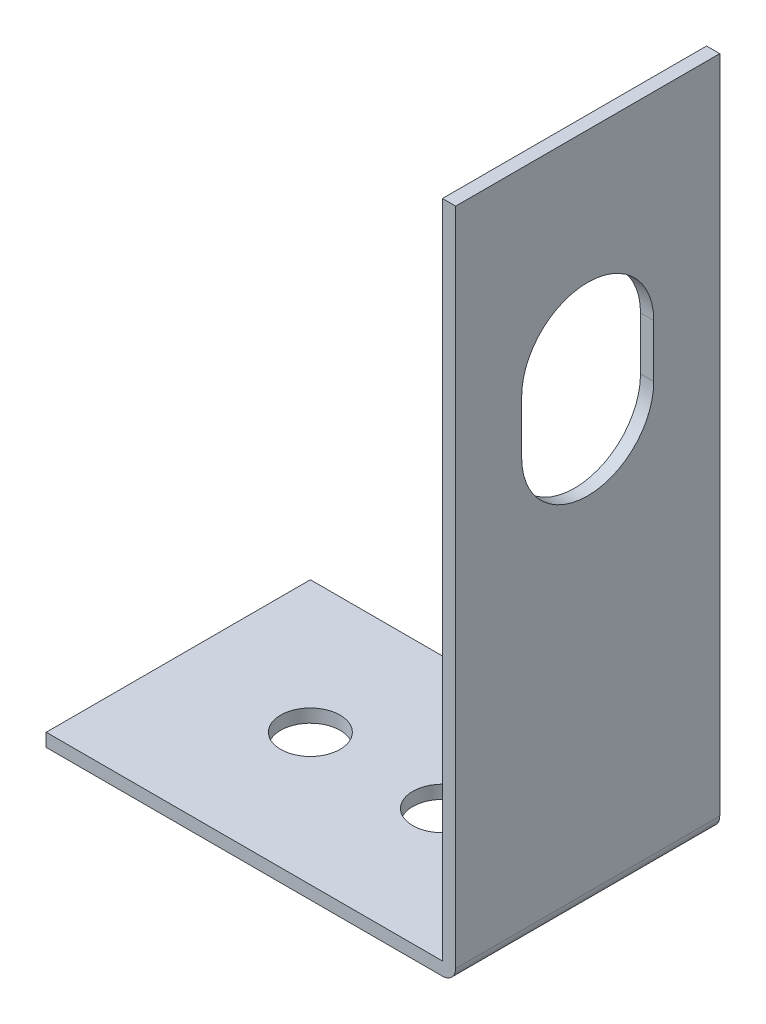
ISO-10303-21;
HEADER;
FILE_DESCRIPTION(('STEP AP214'),'2;1');
FILE_NAME('part.step','',(''),(''),'','','');
FILE_SCHEMA(('AUTOMOTIVE_DESIGN { 1 0 10303 214 1 1 1 1 }'));
ENDSEC;
DATA;
#1=APPLICATION_CONTEXT('core data for automotive mechanical design processes');
#2=APPLICATION_PROTOCOL_DEFINITION('international standard','automotive_design',2000,#1);
#3=PRODUCT_CONTEXT('',#1,'mechanical');
#4=PRODUCT('Part','Part','',(#3));
#5=PRODUCT_RELATED_PRODUCT_CATEGORY('part','',(#4));
#6=PRODUCT_DEFINITION_FORMATION('','',#4);
#7=PRODUCT_DEFINITION_CONTEXT('part definition',#1,'design');
#8=PRODUCT_DEFINITION('design','',#6,#7);
#9=PRODUCT_DEFINITION_SHAPE('','',#8);
#10=(LENGTH_UNIT() NAMED_UNIT(*) SI_UNIT(.MILLI.,.METRE.));
#11=(NAMED_UNIT(*) PLANE_ANGLE_UNIT() SI_UNIT($,.RADIAN.));
#12=(NAMED_UNIT(*) SI_UNIT($,.STERADIAN.) SOLID_ANGLE_UNIT());
#13=UNCERTAINTY_MEASURE_WITH_UNIT(LENGTH_MEASURE(1.E-05),#10,'distance_accuracy_value','');
#14=(GEOMETRIC_REPRESENTATION_CONTEXT(3) GLOBAL_UNCERTAINTY_ASSIGNED_CONTEXT((#13)) GLOBAL_UNIT_ASSIGNED_CONTEXT((#10,
#11,#12)) REPRESENTATION_CONTEXT('',''));
#15=CARTESIAN_POINT('',(0.,0.,0.));
#16=DIRECTION('',(0.,0.,1.));
#17=DIRECTION('',(1.,0.,0.));
#18=AXIS2_PLACEMENT_3D('',#15,#16,#17);
#19=CARTESIAN_POINT('',(0.,0.,20.));
#20=DIRECTION('',(0.,-1.,0.));
#21=DIRECTION('',(1.,0.,0.));
#22=AXIS2_PLACEMENT_3D('',#19,#20,#21);
#23=PLANE('',#22);
#24=CARTESIAN_POINT('',(-20.,0.,10.));
#25=DIRECTION('',(0.,1.,0.));
#26=DIRECTION('',(-1.,0.,0.));
#27=AXIS2_PLACEMENT_3D('',#24,#25,#26);
#28=CIRCLE('',#27,2.25);
#29=CARTESIAN_POINT('',(-22.25,0.,10.));
#30=VERTEX_POINT('',#29);
#31=EDGE_CURVE('E252',#30,#30,#28,.T.);
#32=ORIENTED_EDGE('',*,*,#31,.F.);
#33=EDGE_LOOP('',(#32));
#34=FACE_BOUND('',#33,.T.);
#35=CARTESIAN_POINT('',(-10.,0.,10.));
#36=DIRECTION('',(0.,1.,0.));
#37=DIRECTION('',(-1.,0.,0.));
#38=AXIS2_PLACEMENT_3D('',#35,#36,#37);
#39=CIRCLE('',#38,2.25);
#40=CARTESIAN_POINT('',(-12.25,0.,10.));
#41=VERTEX_POINT('',#40);
#42=EDGE_CURVE('E140',#41,#41,#39,.T.);
#43=ORIENTED_EDGE('',*,*,#42,.F.);
#44=EDGE_LOOP('',(#43));
#45=FACE_BOUND('',#44,.T.);
#46=DIRECTION('',(-1.,0.,0.));
#47=VECTOR('',#46,1.);
#48=CARTESIAN_POINT('',(0.,0.,0.));
#49=LINE('',#48,#47);
#50=CARTESIAN_POINT('',(0.,0.,0.));
#51=VERTEX_POINT('',#50);
#52=CARTESIAN_POINT('',(-30.,0.,0.));
#53=VERTEX_POINT('',#52);
#54=EDGE_CURVE('E153',#51,#53,#49,.T.);
#55=ORIENTED_EDGE('',*,*,#54,.T.);
#56=DIRECTION('',(0.,0.,-1.));
#57=VECTOR('',#56,1.);
#58=CARTESIAN_POINT('',(-30.,0.,20.));
#59=LINE('',#58,#57);
#60=CARTESIAN_POINT('',(-30.,0.,20.));
#61=VERTEX_POINT('',#60);
#62=EDGE_CURVE('E11',#61,#53,#59,.T.);
#63=ORIENTED_EDGE('',*,*,#62,.F.);
#64=DIRECTION('',(-1.,0.,0.));
#65=VECTOR('',#64,1.);
#66=CARTESIAN_POINT('',(0.,0.,20.));
#67=LINE('',#66,#65);
#68=CARTESIAN_POINT('',(0.,0.,20.));
#69=VERTEX_POINT('',#68);
#70=EDGE_CURVE('E157',#69,#61,#67,.T.);
#71=ORIENTED_EDGE('',*,*,#70,.F.);
#72=DIRECTION('',(0.,0.,-1.));
#73=VECTOR('',#72,1.);
#74=CARTESIAN_POINT('',(0.,0.,20.));
#75=LINE('',#74,#73);
#76=EDGE_CURVE('E173',#69,#51,#75,.T.);
#77=ORIENTED_EDGE('',*,*,#76,.T.);
#78=EDGE_LOOP('',(#55,#63,#71,#77));
#79=FACE_BOUND('',#78,.T.);
#80=ADVANCED_FACE('F34',(#34,#45,#79),#23,.F.);
#81=CARTESIAN_POINT('',(-30.,0.,20.));
#82=DIRECTION('',(1.,0.,0.));
#83=DIRECTION('',(0.,0.,-1.));
#84=AXIS2_PLACEMENT_3D('',#81,#82,#83);
#85=PLANE('',#84);
#86=DIRECTION('',(0.,-1.,0.));
#87=VECTOR('',#86,1.);
#88=CARTESIAN_POINT('',(-30.,0.,0.));
#89=LINE('',#88,#87);
#90=CARTESIAN_POINT('',(-30.,-1.,0.));
#91=VERTEX_POINT('',#90);
#92=EDGE_CURVE('E176',#53,#91,#89,.T.);
#93=ORIENTED_EDGE('',*,*,#92,.T.);
#94=DIRECTION('',(0.,0.,-1.));
#95=VECTOR('',#94,1.);
#96=CARTESIAN_POINT('',(-30.,-1.,20.));
#97=LINE('',#96,#95);
#98=CARTESIAN_POINT('',(-30.,-1.,20.));
#99=VERTEX_POINT('',#98);
#100=EDGE_CURVE('E41',#99,#91,#97,.T.);
#101=ORIENTED_EDGE('',*,*,#100,.F.);
#102=DIRECTION('',(0.,-1.,0.));
#103=VECTOR('',#102,1.);
#104=CARTESIAN_POINT('',(-30.,0.,20.));
#105=LINE('',#104,#103);
#106=EDGE_CURVE('E160',#61,#99,#105,.T.);
#107=ORIENTED_EDGE('',*,*,#106,.F.);
#108=ORIENTED_EDGE('',*,*,#62,.T.);
#109=EDGE_LOOP('',(#93,#101,#107,#108));
#110=FACE_BOUND('',#109,.T.);
#111=ADVANCED_FACE('F226',(#110),#85,.F.);
#112=CARTESIAN_POINT('',(0.,-0.999999999999997,20.));
#113=DIRECTION('',(0.,1.,0.));
#114=DIRECTION('',(-1.,0.,0.));
#115=AXIS2_PLACEMENT_3D('',#112,#113,#114);
#116=PLANE('',#115);
#117=CARTESIAN_POINT('',(-20.,-1.,10.));
#118=DIRECTION('',(0.,1.,0.));
#119=DIRECTION('',(-1.,0.,0.));
#120=AXIS2_PLACEMENT_3D('',#117,#118,#119);
#121=CIRCLE('',#120,2.25);
#122=CARTESIAN_POINT('',(-22.25,-1.,10.));
#123=VERTEX_POINT('',#122);
#124=EDGE_CURVE('E256',#123,#123,#121,.T.);
#125=ORIENTED_EDGE('',*,*,#124,.T.);
#126=EDGE_LOOP('',(#125));
#127=FACE_BOUND('',#126,.T.);
#128=CARTESIAN_POINT('',(-10.,-1.,10.));
#129=DIRECTION('',(0.,1.,0.));
#130=DIRECTION('',(-1.,0.,0.));
#131=AXIS2_PLACEMENT_3D('',#128,#129,#130);
#132=CIRCLE('',#131,2.25);
#133=CARTESIAN_POINT('',(-12.25,-1.,10.));
#134=VERTEX_POINT('',#133);
#135=EDGE_CURVE('E147',#134,#134,#132,.T.);
#136=ORIENTED_EDGE('',*,*,#135,.T.);
#137=EDGE_LOOP('',(#136));
#138=FACE_BOUND('',#137,.T.);
#139=DIRECTION('',(1.,0.,0.));
#140=VECTOR('',#139,1.);
#141=CARTESIAN_POINT('',(0.,-0.999999999999997,0.));
#142=LINE('',#141,#140);
#143=CARTESIAN_POINT('',(0.,-0.999999999999999,0.));
#144=VERTEX_POINT('',#143);
#145=EDGE_CURVE('E178',#91,#144,#142,.T.);
#146=ORIENTED_EDGE('',*,*,#145,.T.);
#147=DIRECTION('',(0.,0.,-1.));
#148=VECTOR('',#147,1.);
#149=CARTESIAN_POINT('',(0.,-0.999999999999999,20.));
#150=LINE('',#149,#148);
#151=CARTESIAN_POINT('',(0.,-0.999999999999999,20.));
#152=VERTEX_POINT('',#151);
#153=EDGE_CURVE('E198',#152,#144,#150,.T.);
#154=ORIENTED_EDGE('',*,*,#153,.F.);
#155=DIRECTION('',(1.,0.,0.));
#156=VECTOR('',#155,1.);
#157=CARTESIAN_POINT('',(0.,-0.999999999999997,20.));
#158=LINE('',#157,#156);
#159=EDGE_CURVE('E163',#99,#152,#158,.T.);
#160=ORIENTED_EDGE('',*,*,#159,.F.);
#161=ORIENTED_EDGE('',*,*,#100,.T.);
#162=EDGE_LOOP('',(#146,#154,#160,#161));
#163=FACE_BOUND('',#162,.T.);
#164=ADVANCED_FACE('F205',(#127,#138,#163),#116,.F.);
#165=CARTESIAN_POINT('',(0.,0.,20.));
#166=DIRECTION('',(0.,0.,-1.));
#167=DIRECTION('',(-1.,0.,0.));
#168=AXIS2_PLACEMENT_3D('',#165,#166,#167);
#169=CYLINDRICAL_SURFACE('',#168,0.999999999999997);
#170=CARTESIAN_POINT('',(0.,0.,0.));
#171=DIRECTION('',(0.,0.,1.));
#172=DIRECTION('',(1.,0.,0.));
#173=AXIS2_PLACEMENT_3D('',#170,#171,#172);
#174=CIRCLE('',#173,0.999999999999997);
#175=CARTESIAN_POINT('',(0.999999999999999,0.,0.));
#176=VERTEX_POINT('',#175);
#177=EDGE_CURVE('E180',#144,#176,#174,.T.);
#178=ORIENTED_EDGE('',*,*,#177,.T.);
#179=DIRECTION('',(0.,0.,-1.));
#180=VECTOR('',#179,1.);
#181=CARTESIAN_POINT('',(0.999999999999999,0.,20.));
#182=LINE('',#181,#180);
#183=CARTESIAN_POINT('',(0.999999999999999,0.,20.));
#184=VERTEX_POINT('',#183);
#185=EDGE_CURVE('E195',#184,#176,#182,.T.);
#186=ORIENTED_EDGE('',*,*,#185,.F.);
#187=CARTESIAN_POINT('',(0.,0.,20.));
#188=DIRECTION('',(0.,0.,1.));
#189=DIRECTION('',(1.,0.,0.));
#190=AXIS2_PLACEMENT_3D('',#187,#188,#189);
#191=CIRCLE('',#190,0.999999999999997);
#192=EDGE_CURVE('E165',#152,#184,#191,.T.);
#193=ORIENTED_EDGE('',*,*,#192,.F.);
#194=ORIENTED_EDGE('',*,*,#153,.T.);
#195=EDGE_LOOP('',(#178,#186,#193,#194));
#196=FACE_BOUND('',#195,.T.);
#197=ADVANCED_FACE('F216',(#196),#169,.T.);
#198=CARTESIAN_POINT('',(0.999999999999999,0.,20.));
#199=DIRECTION('',(-1.,0.,0.));
#200=DIRECTION('',(0.,-1.,0.));
#201=AXIS2_PLACEMENT_3D('',#198,#199,#200);
#202=PLANE('',#201);
#203=DIRECTION('',(0.,1.,0.));
#204=VECTOR('',#203,1.);
#205=CARTESIAN_POINT('',(1.,35.,15.));
#206=LINE('',#205,#204);
#207=CARTESIAN_POINT('',(1.,31.,15.));
#208=VERTEX_POINT('',#207);
#209=CARTESIAN_POINT('',(1.,35.,15.));
#210=VERTEX_POINT('',#209);
#211=EDGE_CURVE('E124',#208,#210,#206,.T.);
#212=ORIENTED_EDGE('',*,*,#211,.T.);
#213=CARTESIAN_POINT('',(1.,35.,10.));
#214=DIRECTION('',(-1.,0.,0.));
#215=DIRECTION('',(0.,0.,1.));
#216=AXIS2_PLACEMENT_3D('',#213,#214,#215);
#217=CIRCLE('',#216,5.);
#218=CARTESIAN_POINT('',(1.,35.,5.));
#219=VERTEX_POINT('',#218);
#220=EDGE_CURVE('E118',#210,#219,#217,.T.);
#221=ORIENTED_EDGE('',*,*,#220,.T.);
#222=DIRECTION('',(0.,-1.,0.));
#223=VECTOR('',#222,1.);
#224=CARTESIAN_POINT('',(1.,35.,5.));
#225=LINE('',#224,#223);
#226=CARTESIAN_POINT('',(1.,31.,5.));
#227=VERTEX_POINT('',#226);
#228=EDGE_CURVE('E127',#219,#227,#225,.T.);
#229=ORIENTED_EDGE('',*,*,#228,.T.);
#230=CARTESIAN_POINT('',(1.,31.,10.));
#231=DIRECTION('',(-1.,0.,0.));
#232=DIRECTION('',(0.,0.,1.));
#233=AXIS2_PLACEMENT_3D('',#230,#231,#232);
#234=CIRCLE('',#233,5.);
#235=EDGE_CURVE('E48',#227,#208,#234,.T.);
#236=ORIENTED_EDGE('',*,*,#235,.T.);
#237=EDGE_LOOP('',(#212,#221,#229,#236));
#238=FACE_BOUND('',#237,.T.);
#239=DIRECTION('',(0.,1.,0.));
#240=VECTOR('',#239,1.);
#241=CARTESIAN_POINT('',(0.999999999999999,0.,0.));
#242=LINE('',#241,#240);
#243=CARTESIAN_POINT('',(1.,50.,0.));
#244=VERTEX_POINT('',#243);
#245=EDGE_CURVE('E182',#176,#244,#242,.T.);
#246=ORIENTED_EDGE('',*,*,#245,.T.);
#247=DIRECTION('',(0.,0.,-1.));
#248=VECTOR('',#247,1.);
#249=CARTESIAN_POINT('',(1.,50.,20.));
#250=LINE('',#249,#248);
#251=CARTESIAN_POINT('',(1.,50.,20.));
#252=VERTEX_POINT('',#251);
#253=EDGE_CURVE('E192',#252,#244,#250,.T.);
#254=ORIENTED_EDGE('',*,*,#253,.F.);
#255=DIRECTION('',(0.,1.,0.));
#256=VECTOR('',#255,1.);
#257=CARTESIAN_POINT('',(0.999999999999999,0.,20.));
#258=LINE('',#257,#256);
#259=EDGE_CURVE('E167',#184,#252,#258,.T.);
#260=ORIENTED_EDGE('',*,*,#259,.F.);
#261=ORIENTED_EDGE('',*,*,#185,.T.);
#262=EDGE_LOOP('',(#246,#254,#260,#261));
#263=FACE_BOUND('',#262,.T.);
#264=ADVANCED_FACE('F131',(#238,#263),#202,.F.);
#265=CARTESIAN_POINT('',(0.,50.,20.));
#266=DIRECTION('',(0.,-1.,0.));
#267=DIRECTION('',(0.,0.,-1.));
#268=AXIS2_PLACEMENT_3D('',#265,#266,#267);
#269=PLANE('',#268);
#270=DIRECTION('',(-1.,0.,0.));
#271=VECTOR('',#270,1.);
#272=CARTESIAN_POINT('',(0.,50.,0.));
#273=LINE('',#272,#271);
#274=CARTESIAN_POINT('',(0.,50.,0.));
#275=VERTEX_POINT('',#274);
#276=EDGE_CURVE('E184',#244,#275,#273,.T.);
#277=ORIENTED_EDGE('',*,*,#276,.T.);
#278=DIRECTION('',(0.,0.,-1.));
#279=VECTOR('',#278,1.);
#280=CARTESIAN_POINT('',(0.,50.,20.));
#281=LINE('',#280,#279);
#282=CARTESIAN_POINT('',(0.,50.,20.));
#283=VERTEX_POINT('',#282);
#284=EDGE_CURVE('E189',#283,#275,#281,.T.);
#285=ORIENTED_EDGE('',*,*,#284,.F.);
#286=DIRECTION('',(-1.,0.,0.));
#287=VECTOR('',#286,1.);
#288=CARTESIAN_POINT('',(0.,50.,20.));
#289=LINE('',#288,#287);
#290=EDGE_CURVE('E169',#252,#283,#289,.T.);
#291=ORIENTED_EDGE('',*,*,#290,.F.);
#292=ORIENTED_EDGE('',*,*,#253,.T.);
#293=EDGE_LOOP('',(#277,#285,#291,#292));
#294=FACE_BOUND('',#293,.T.);
#295=ADVANCED_FACE('F234',(#294),#269,.F.);
#296=CARTESIAN_POINT('',(0.,0.,20.));
#297=DIRECTION('',(1.,0.,0.));
#298=DIRECTION('',(0.,0.,-1.));
#299=AXIS2_PLACEMENT_3D('',#296,#297,#298);
#300=PLANE('',#299);
#301=DIRECTION('',(0.,-1.,0.));
#302=VECTOR('',#301,1.);
#303=CARTESIAN_POINT('',(0.,35.,5.));
#304=LINE('',#303,#302);
#305=CARTESIAN_POINT('',(0.,35.,5.));
#306=VERTEX_POINT('',#305);
#307=CARTESIAN_POINT('',(0.,31.,5.));
#308=VERTEX_POINT('',#307);
#309=EDGE_CURVE('E146',#306,#308,#304,.T.);
#310=ORIENTED_EDGE('',*,*,#309,.F.);
#311=CARTESIAN_POINT('',(0.,35.,10.));
#312=DIRECTION('',(-1.,0.,0.));
#313=DIRECTION('',(0.,0.,1.));
#314=AXIS2_PLACEMENT_3D('',#311,#312,#313);
#315=CIRCLE('',#314,5.);
#316=CARTESIAN_POINT('',(0.,35.,15.));
#317=VERTEX_POINT('',#316);
#318=EDGE_CURVE('E56',#317,#306,#315,.T.);
#319=ORIENTED_EDGE('',*,*,#318,.F.);
#320=DIRECTION('',(0.,1.,0.));
#321=VECTOR('',#320,1.);
#322=CARTESIAN_POINT('',(0.,35.,15.));
#323=LINE('',#322,#321);
#324=CARTESIAN_POINT('',(0.,31.,15.));
#325=VERTEX_POINT('',#324);
#326=EDGE_CURVE('E134',#325,#317,#323,.T.);
#327=ORIENTED_EDGE('',*,*,#326,.F.);
#328=CARTESIAN_POINT('',(0.,31.,10.));
#329=DIRECTION('',(-1.,0.,0.));
#330=DIRECTION('',(0.,0.,1.));
#331=AXIS2_PLACEMENT_3D('',#328,#329,#330);
#332=CIRCLE('',#331,5.);
#333=EDGE_CURVE('E137',#308,#325,#332,.T.);
#334=ORIENTED_EDGE('',*,*,#333,.F.);
#335=EDGE_LOOP('',(#310,#319,#327,#334));
#336=FACE_BOUND('',#335,.T.);
#337=DIRECTION('',(0.,-1.,0.));
#338=VECTOR('',#337,1.);
#339=CARTESIAN_POINT('',(0.,0.,0.));
#340=LINE('',#339,#338);
#341=EDGE_CURVE('E161',#275,#51,#340,.T.);
#342=ORIENTED_EDGE('',*,*,#341,.T.);
#343=ORIENTED_EDGE('',*,*,#76,.F.);
#344=DIRECTION('',(0.,-1.,0.));
#345=VECTOR('',#344,1.);
#346=CARTESIAN_POINT('',(0.,0.,20.));
#347=LINE('',#346,#345);
#348=EDGE_CURVE('E171',#283,#69,#347,.T.);
#349=ORIENTED_EDGE('',*,*,#348,.F.);
#350=ORIENTED_EDGE('',*,*,#284,.T.);
#351=EDGE_LOOP('',(#342,#343,#349,#350));
#352=FACE_BOUND('',#351,.T.);
#353=ADVANCED_FACE('F231',(#336,#352),#300,.F.);
#354=CARTESIAN_POINT('',(0.,0.,20.));
#355=DIRECTION('',(0.,0.,1.));
#356=DIRECTION('',(1.,0.,0.));
#357=AXIS2_PLACEMENT_3D('',#354,#355,#356);
#358=PLANE('',#357);
#359=ORIENTED_EDGE('',*,*,#70,.T.);
#360=ORIENTED_EDGE('',*,*,#106,.T.);
#361=ORIENTED_EDGE('',*,*,#159,.T.);
#362=ORIENTED_EDGE('',*,*,#192,.T.);
#363=ORIENTED_EDGE('',*,*,#259,.T.);
#364=ORIENTED_EDGE('',*,*,#290,.T.);
#365=ORIENTED_EDGE('',*,*,#348,.T.);
#366=EDGE_LOOP('',(#359,#360,#361,#362,#363,#364,#365));
#367=FACE_BOUND('',#366,.T.);
#368=ADVANCED_FACE('F222',(#367),#358,.T.);
#369=CARTESIAN_POINT('',(0.,0.,0.));
#370=DIRECTION('',(0.,0.,1.));
#371=DIRECTION('',(1.,0.,0.));
#372=AXIS2_PLACEMENT_3D('',#369,#370,#371);
#373=PLANE('',#372);
#374=ORIENTED_EDGE('',*,*,#54,.F.);
#375=ORIENTED_EDGE('',*,*,#341,.F.);
#376=ORIENTED_EDGE('',*,*,#276,.F.);
#377=ORIENTED_EDGE('',*,*,#245,.F.);
#378=ORIENTED_EDGE('',*,*,#177,.F.);
#379=ORIENTED_EDGE('',*,*,#145,.F.);
#380=ORIENTED_EDGE('',*,*,#92,.F.);
#381=EDGE_LOOP('',(#374,#375,#376,#377,#378,#379,#380));
#382=FACE_BOUND('',#381,.T.);
#383=ADVANCED_FACE('F211',(#382),#373,.F.);
#384=CARTESIAN_POINT('',(1.,35.,10.));
#385=DIRECTION('',(-1.,0.,0.));
#386=DIRECTION('',(0.,0.,1.));
#387=AXIS2_PLACEMENT_3D('',#384,#385,#386);
#388=CYLINDRICAL_SURFACE('',#387,5.);
#389=ORIENTED_EDGE('',*,*,#318,.T.);
#390=DIRECTION('',(-1.,0.,0.));
#391=VECTOR('',#390,1.);
#392=CARTESIAN_POINT('',(1.,35.,5.));
#393=LINE('',#392,#391);
#394=EDGE_CURVE('E114',#219,#306,#393,.T.);
#395=ORIENTED_EDGE('',*,*,#394,.F.);
#396=ORIENTED_EDGE('',*,*,#220,.F.);
#397=DIRECTION('',(-1.,0.,0.));
#398=VECTOR('',#397,1.);
#399=CARTESIAN_POINT('',(1.,35.,15.));
#400=LINE('',#399,#398);
#401=EDGE_CURVE('E151',#210,#317,#400,.T.);
#402=ORIENTED_EDGE('',*,*,#401,.T.);
#403=EDGE_LOOP('',(#389,#395,#396,#402));
#404=FACE_BOUND('',#403,.T.);
#405=ADVANCED_FACE('F116',(#404),#388,.F.);
#406=CARTESIAN_POINT('',(1.,35.,15.));
#407=DIRECTION('',(0.,0.,1.));
#408=DIRECTION('',(0.,-1.,0.));
#409=AXIS2_PLACEMENT_3D('',#406,#407,#408);
#410=PLANE('',#409);
#411=ORIENTED_EDGE('',*,*,#326,.T.);
#412=ORIENTED_EDGE('',*,*,#401,.F.);
#413=ORIENTED_EDGE('',*,*,#211,.F.);
#414=DIRECTION('',(-1.,0.,0.));
#415=VECTOR('',#414,1.);
#416=CARTESIAN_POINT('',(1.,31.,15.));
#417=LINE('',#416,#415);
#418=EDGE_CURVE('E154',#208,#325,#417,.T.);
#419=ORIENTED_EDGE('',*,*,#418,.T.);
#420=EDGE_LOOP('',(#411,#412,#413,#419));
#421=FACE_BOUND('',#420,.T.);
#422=ADVANCED_FACE('F275',(#421),#410,.F.);
#423=CARTESIAN_POINT('',(1.,31.,10.));
#424=DIRECTION('',(-1.,0.,0.));
#425=DIRECTION('',(0.,0.,1.));
#426=AXIS2_PLACEMENT_3D('',#423,#424,#425);
#427=CYLINDRICAL_SURFACE('',#426,5.);
#428=ORIENTED_EDGE('',*,*,#333,.T.);
#429=ORIENTED_EDGE('',*,*,#418,.F.);
#430=ORIENTED_EDGE('',*,*,#235,.F.);
#431=DIRECTION('',(-1.,0.,0.));
#432=VECTOR('',#431,1.);
#433=CARTESIAN_POINT('',(1.,31.,5.));
#434=LINE('',#433,#432);
#435=EDGE_CURVE('E123',#227,#308,#434,.T.);
#436=ORIENTED_EDGE('',*,*,#435,.T.);
#437=EDGE_LOOP('',(#428,#429,#430,#436));
#438=FACE_BOUND('',#437,.T.);
#439=ADVANCED_FACE('F278',(#438),#427,.F.);
#440=CARTESIAN_POINT('',(1.,35.,5.));
#441=DIRECTION('',(0.,0.,-1.));
#442=DIRECTION('',(0.,1.,0.));
#443=AXIS2_PLACEMENT_3D('',#440,#441,#442);
#444=PLANE('',#443);
#445=ORIENTED_EDGE('',*,*,#309,.T.);
#446=ORIENTED_EDGE('',*,*,#435,.F.);
#447=ORIENTED_EDGE('',*,*,#228,.F.);
#448=ORIENTED_EDGE('',*,*,#394,.T.);
#449=EDGE_LOOP('',(#445,#446,#447,#448));
#450=FACE_BOUND('',#449,.T.);
#451=ADVANCED_FACE('F128',(#450),#444,.F.);
#452=CARTESIAN_POINT('',(-10.,-1.,10.));
#453=DIRECTION('',(0.,1.,0.));
#454=DIRECTION('',(-1.,0.,0.));
#455=AXIS2_PLACEMENT_3D('',#452,#453,#454);
#456=CYLINDRICAL_SURFACE('',#455,2.25);
#457=ORIENTED_EDGE('',*,*,#135,.F.);
#458=EDGE_LOOP('',(#457));
#459=FACE_BOUND('',#458,.T.);
#460=ORIENTED_EDGE('',*,*,#42,.T.);
#461=EDGE_LOOP('',(#460));
#462=FACE_BOUND('',#461,.T.);
#463=ADVANCED_FACE('F266',(#459,#462),#456,.F.);
#464=CARTESIAN_POINT('',(-20.,-1.,10.));
#465=DIRECTION('',(0.,1.,0.));
#466=DIRECTION('',(-1.,0.,0.));
#467=AXIS2_PLACEMENT_3D('',#464,#465,#466);
#468=CYLINDRICAL_SURFACE('',#467,2.25);
#469=ORIENTED_EDGE('',*,*,#124,.F.);
#470=EDGE_LOOP('',(#469));
#471=FACE_BOUND('',#470,.T.);
#472=ORIENTED_EDGE('',*,*,#31,.T.);
#473=EDGE_LOOP('',(#472));
#474=FACE_BOUND('',#473,.T.);
#475=ADVANCED_FACE('F264',(#471,#474),#468,.F.);
#476=CLOSED_SHELL('',(#80,#111,#164,#197,#264,#295,#353,#368,#383,#405,#422,#439,#451,#463,#475));
#477=MANIFOLD_SOLID_BREP('B2',#476);
#478=ADVANCED_BREP_SHAPE_REPRESENTATION('',(#18,#477),#14);
#479=SHAPE_DEFINITION_REPRESENTATION(#9,#478);
ENDSEC;
END-ISO-10303-21;
